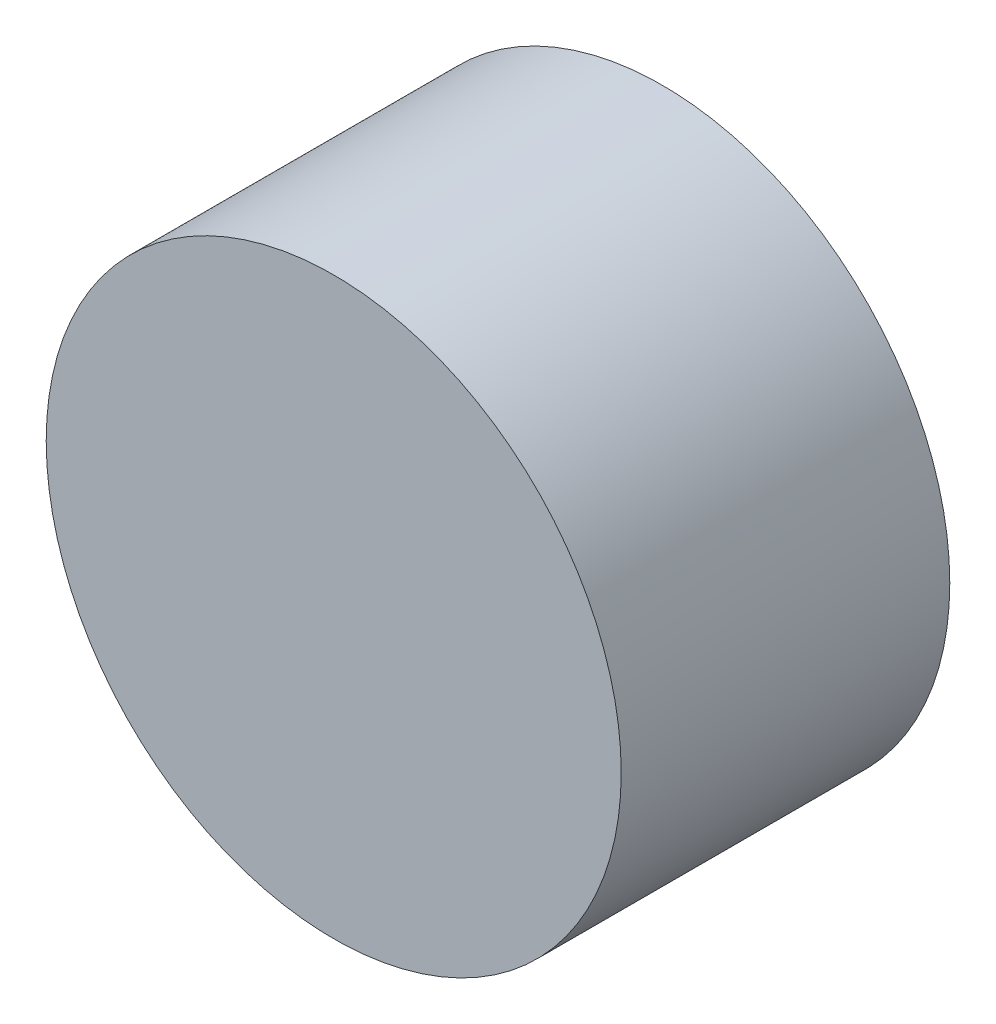
ISO-10303-21;
HEADER;
FILE_DESCRIPTION(('STEP AP214'),'2;1');
FILE_NAME('part.step','',(''),(''),'','','');
FILE_SCHEMA(('AUTOMOTIVE_DESIGN { 1 0 10303 214 1 1 1 1 }'));
ENDSEC;
DATA;
#1=APPLICATION_CONTEXT('core data for automotive mechanical design processes');
#2=APPLICATION_PROTOCOL_DEFINITION('international standard','automotive_design',2000,#1);
#3=PRODUCT_CONTEXT('',#1,'mechanical');
#4=PRODUCT('Part','Part','',(#3));
#5=PRODUCT_RELATED_PRODUCT_CATEGORY('part','',(#4));
#6=PRODUCT_DEFINITION_FORMATION('','',#4);
#7=PRODUCT_DEFINITION_CONTEXT('part definition',#1,'design');
#8=PRODUCT_DEFINITION('design','',#6,#7);
#9=PRODUCT_DEFINITION_SHAPE('','',#8);
#10=(LENGTH_UNIT() NAMED_UNIT(*) SI_UNIT(.MILLI.,.METRE.));
#11=(NAMED_UNIT(*) PLANE_ANGLE_UNIT() SI_UNIT($,.RADIAN.));
#12=(NAMED_UNIT(*) SI_UNIT($,.STERADIAN.) SOLID_ANGLE_UNIT());
#13=UNCERTAINTY_MEASURE_WITH_UNIT(LENGTH_MEASURE(1.E-05),#10,'distance_accuracy_value','');
#14=(GEOMETRIC_REPRESENTATION_CONTEXT(3) GLOBAL_UNCERTAINTY_ASSIGNED_CONTEXT((#13)) GLOBAL_UNIT_ASSIGNED_CONTEXT((#10,
#11,#12)) REPRESENTATION_CONTEXT('',''));
#15=CARTESIAN_POINT('',(0.,0.,0.));
#16=DIRECTION('',(0.,0.,1.));
#17=DIRECTION('',(1.,0.,0.));
#18=AXIS2_PLACEMENT_3D('',#15,#16,#17);
#19=CARTESIAN_POINT('',(0.,0.,16.));
#20=DIRECTION('',(0.,0.,-1.));
#21=DIRECTION('',(-1.,0.,0.));
#22=AXIS2_PLACEMENT_3D('',#19,#20,#21);
#23=CYLINDRICAL_SURFACE('',#22,14.);
#24=CARTESIAN_POINT('',(0.,0.,16.));
#25=DIRECTION('',(0.,0.,1.));
#26=DIRECTION('',(1.,0.,0.));
#27=AXIS2_PLACEMENT_3D('',#24,#25,#26);
#28=CIRCLE('',#27,14.);
#29=CARTESIAN_POINT('',(14.,0.,16.));
#30=VERTEX_POINT('',#29);
#31=EDGE_CURVE('E10',#30,#30,#28,.T.);
#32=ORIENTED_EDGE('',*,*,#31,.F.);
#33=EDGE_LOOP('',(#32));
#34=FACE_BOUND('',#33,.T.);
#35=CARTESIAN_POINT('',(0.,0.,0.));
#36=DIRECTION('',(0.,0.,1.));
#37=DIRECTION('',(1.,0.,0.));
#38=AXIS2_PLACEMENT_3D('',#35,#36,#37);
#39=CIRCLE('',#38,14.);
#40=CARTESIAN_POINT('',(14.,0.,0.));
#41=VERTEX_POINT('',#40);
#42=EDGE_CURVE('E40',#41,#41,#39,.T.);
#43=ORIENTED_EDGE('',*,*,#42,.T.);
#44=EDGE_LOOP('',(#43));
#45=FACE_BOUND('',#44,.T.);
#46=ADVANCED_FACE('F37',(#34,#45),#23,.T.);
#47=CARTESIAN_POINT('',(0.,0.,16.));
#48=DIRECTION('',(0.,0.,1.));
#49=DIRECTION('',(1.,0.,0.));
#50=AXIS2_PLACEMENT_3D('',#47,#48,#49);
#51=PLANE('',#50);
#52=ORIENTED_EDGE('',*,*,#31,.T.);
#53=EDGE_LOOP('',(#52));
#54=FACE_BOUND('',#53,.T.);
#55=ADVANCED_FACE('F70',(#54),#51,.T.);
#56=CARTESIAN_POINT('',(0.,0.,0.));
#57=DIRECTION('',(0.,0.,1.));
#58=DIRECTION('',(1.,0.,0.));
#59=AXIS2_PLACEMENT_3D('',#56,#57,#58);
#60=PLANE('',#59);
#61=CARTESIAN_POINT('',(0.,0.,0.));
#62=DIRECTION('',(0.,0.,-1.));
#63=DIRECTION('',(-1.,0.,0.));
#64=AXIS2_PLACEMENT_3D('',#61,#62,#63);
#65=CIRCLE('',#64,9.51);
#66=CARTESIAN_POINT('',(-9.51,0.,0.));
#67=VERTEX_POINT('',#66);
#68=EDGE_CURVE('E51',#67,#67,#65,.T.);
#69=ORIENTED_EDGE('',*,*,#68,.F.);
#70=EDGE_LOOP('',(#69));
#71=FACE_BOUND('',#70,.T.);
#72=ORIENTED_EDGE('',*,*,#42,.F.);
#73=EDGE_LOOP('',(#72));
#74=FACE_BOUND('',#73,.T.);
#75=ADVANCED_FACE('F64',(#71,#74),#60,.F.);
#76=CARTESIAN_POINT('',(0.,0.,8.));
#77=DIRECTION('',(0.,0.,-1.));
#78=DIRECTION('',(-1.,0.,0.));
#79=AXIS2_PLACEMENT_3D('',#76,#77,#78);
#80=CYLINDRICAL_SURFACE('',#79,9.51);
#81=CARTESIAN_POINT('',(0.,0.,8.));
#82=DIRECTION('',(0.,0.,-1.));
#83=DIRECTION('',(-1.,0.,0.));
#84=AXIS2_PLACEMENT_3D('',#81,#82,#83);
#85=CIRCLE('',#84,9.51);
#86=CARTESIAN_POINT('',(-9.51,0.,8.00000000000001));
#87=VERTEX_POINT('',#86);
#88=EDGE_CURVE('E49',#87,#87,#85,.T.);
#89=ORIENTED_EDGE('',*,*,#88,.F.);
#90=EDGE_LOOP('',(#89));
#91=FACE_BOUND('',#90,.T.);
#92=ORIENTED_EDGE('',*,*,#68,.T.);
#93=EDGE_LOOP('',(#92));
#94=FACE_BOUND('',#93,.T.);
#95=ADVANCED_FACE('F61',(#91,#94),#80,.F.);
#96=CARTESIAN_POINT('',(0.,0.,8.));
#97=DIRECTION('',(0.,0.,-1.));
#98=DIRECTION('',(-1.,0.,0.));
#99=AXIS2_PLACEMENT_3D('',#96,#97,#98);
#100=PLANE('',#99);
#101=ORIENTED_EDGE('',*,*,#88,.T.);
#102=EDGE_LOOP('',(#101));
#103=FACE_BOUND('',#102,.T.);
#104=ADVANCED_FACE('F59',(#103),#100,.T.);
#105=CLOSED_SHELL('',(#46,#55,#75,#95,#104));
#106=MANIFOLD_SOLID_BREP('B2',#105);
#107=ADVANCED_BREP_SHAPE_REPRESENTATION('',(#18,#106),#14);
#108=SHAPE_DEFINITION_REPRESENTATION(#9,#107);
ENDSEC;
END-ISO-10303-21;
